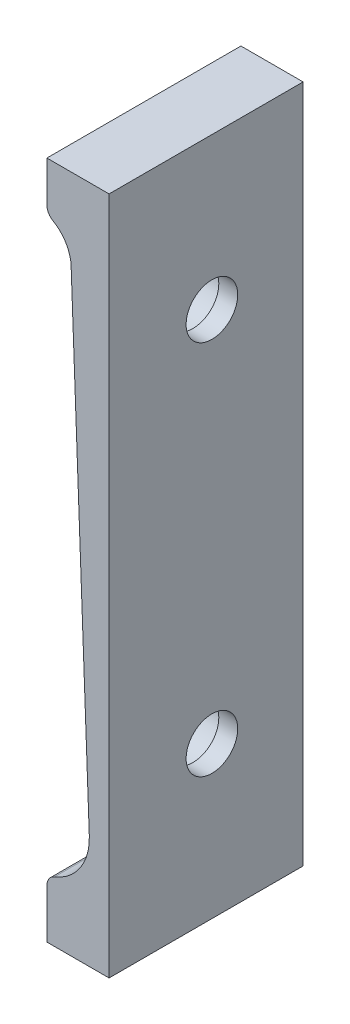
ISO-10303-21;
HEADER;
FILE_DESCRIPTION(('STEP AP214'),'2;1');
FILE_NAME('part.step','',(''),(''),'','','');
FILE_SCHEMA(('AUTOMOTIVE_DESIGN { 1 0 10303 214 1 1 1 1 }'));
ENDSEC;
DATA;
#1=APPLICATION_CONTEXT('core data for automotive mechanical design processes');
#2=APPLICATION_PROTOCOL_DEFINITION('international standard','automotive_design',2000,#1);
#3=PRODUCT_CONTEXT('',#1,'mechanical');
#4=PRODUCT('Part','Part','',(#3));
#5=PRODUCT_RELATED_PRODUCT_CATEGORY('part','',(#4));
#6=PRODUCT_DEFINITION_FORMATION('','',#4);
#7=PRODUCT_DEFINITION_CONTEXT('part definition',#1,'design');
#8=PRODUCT_DEFINITION('design','',#6,#7);
#9=PRODUCT_DEFINITION_SHAPE('','',#8);
#10=(LENGTH_UNIT() NAMED_UNIT(*) SI_UNIT(.MILLI.,.METRE.));
#11=(NAMED_UNIT(*) PLANE_ANGLE_UNIT() SI_UNIT($,.RADIAN.));
#12=(NAMED_UNIT(*) SI_UNIT($,.STERADIAN.) SOLID_ANGLE_UNIT());
#13=UNCERTAINTY_MEASURE_WITH_UNIT(LENGTH_MEASURE(1.E-05),#10,'distance_accuracy_value','');
#14=(GEOMETRIC_REPRESENTATION_CONTEXT(3) GLOBAL_UNCERTAINTY_ASSIGNED_CONTEXT((#13)) GLOBAL_UNIT_ASSIGNED_CONTEXT((#10,
#11,#12)) REPRESENTATION_CONTEXT('',''));
#15=CARTESIAN_POINT('',(0.,0.,0.));
#16=DIRECTION('',(0.,0.,1.));
#17=DIRECTION('',(1.,0.,0.));
#18=AXIS2_PLACEMENT_3D('',#15,#16,#17);
#19=CARTESIAN_POINT('',(110.652882407158,49.5871926880554,-20.574));
#20=DIRECTION('',(-1.,0.,0.));
#21=DIRECTION('',(0.,-1.,0.));
#22=AXIS2_PLACEMENT_3D('',#19,#20,#21);
#23=CYLINDRICAL_SURFACE('',#22,6.75767);
#24=CARTESIAN_POINT('',(110.652882407158,49.5871926880554,-20.574));
#25=DIRECTION('',(-1.,0.,0.));
#26=DIRECTION('',(0.,-1.,0.));
#27=AXIS2_PLACEMENT_3D('',#24,#25,#26);
#28=CIRCLE('',#27,6.75767);
#29=CARTESIAN_POINT('',(110.652882407158,42.8295226880554,-20.574));
#30=VERTEX_POINT('',#29);
#31=EDGE_CURVE('E156',#30,#30,#28,.T.);
#32=ORIENTED_EDGE('',*,*,#31,.F.);
#33=EDGE_LOOP('',(#32));
#34=FACE_BOUND('',#33,.T.);
#35=CARTESIAN_POINT('',(105.699882407158,49.5871926880554,-20.574));
#36=DIRECTION('',(-1.,0.,0.));
#37=DIRECTION('',(0.,-1.,0.));
#38=AXIS2_PLACEMENT_3D('',#35,#36,#37);
#39=CIRCLE('',#38,6.75767);
#40=CARTESIAN_POINT('',(105.699882407158,42.8295226880554,-20.574));
#41=VERTEX_POINT('',#40);
#42=EDGE_CURVE('E240',#41,#41,#39,.F.);
#43=ORIENTED_EDGE('',*,*,#42,.F.);
#44=EDGE_LOOP('',(#43));
#45=FACE_BOUND('',#44,.T.);
#46=ADVANCED_FACE('F44',(#34,#45),#23,.F.);
#47=CARTESIAN_POINT('',(110.652882407158,148.010668688055,-20.574));
#48=DIRECTION('',(-1.,0.,0.));
#49=DIRECTION('',(0.,-1.,0.));
#50=AXIS2_PLACEMENT_3D('',#47,#48,#49);
#51=CYLINDRICAL_SURFACE('',#50,6.75767);
#52=CARTESIAN_POINT('',(110.652882407158,148.010668688055,-20.574));
#53=DIRECTION('',(-1.,0.,0.));
#54=DIRECTION('',(0.,-1.,0.));
#55=AXIS2_PLACEMENT_3D('',#52,#53,#54);
#56=CIRCLE('',#55,6.75767);
#57=CARTESIAN_POINT('',(110.652882407158,141.252998688055,-20.574));
#58=VERTEX_POINT('',#57);
#59=EDGE_CURVE('E153',#58,#58,#56,.T.);
#60=ORIENTED_EDGE('',*,*,#59,.F.);
#61=EDGE_LOOP('',(#60));
#62=FACE_BOUND('',#61,.T.);
#63=CARTESIAN_POINT('',(105.699882407158,148.010668688055,-20.574));
#64=DIRECTION('',(-1.,0.,0.));
#65=DIRECTION('',(0.,-1.,0.));
#66=AXIS2_PLACEMENT_3D('',#63,#64,#65);
#67=CIRCLE('',#66,6.75767);
#68=CARTESIAN_POINT('',(105.699882407158,141.252998688055,-20.574));
#69=VERTEX_POINT('',#68);
#70=EDGE_CURVE('E243',#69,#69,#67,.F.);
#71=ORIENTED_EDGE('',*,*,#70,.F.);
#72=EDGE_LOOP('',(#71));
#73=FACE_BOUND('',#72,.T.);
#74=ADVANCED_FACE('F292',(#62,#73),#51,.F.);
#75=CARTESIAN_POINT('',(110.652882407158,187.698930688055,6.35));
#76=DIRECTION('',(-1.,0.,0.));
#77=DIRECTION('',(0.,-1.,0.));
#78=AXIS2_PLACEMENT_3D('',#75,#76,#77);
#79=PLANE('',#78);
#80=ORIENTED_EDGE('',*,*,#59,.T.);
#81=EDGE_LOOP('',(#80));
#82=FACE_BOUND('',#81,.T.);
#83=ORIENTED_EDGE('',*,*,#31,.T.);
#84=EDGE_LOOP('',(#83));
#85=FACE_BOUND('',#84,.T.);
#86=DIRECTION('',(0.,0.,-1.));
#87=VECTOR('',#86,1.);
#88=CARTESIAN_POINT('',(110.652882407158,9.89893068805531,6.35));
#89=LINE('',#88,#87);
#90=CARTESIAN_POINT('',(110.652882407158,9.89893068805531,6.35));
#91=VERTEX_POINT('',#90);
#92=CARTESIAN_POINT('',(110.652882407158,9.89893068805536,-44.45));
#93=VERTEX_POINT('',#92);
#94=EDGE_CURVE('E125',#91,#93,#89,.T.);
#95=ORIENTED_EDGE('',*,*,#94,.T.);
#96=DIRECTION('',(0.,-1.,0.));
#97=VECTOR('',#96,1.);
#98=CARTESIAN_POINT('',(110.652882407158,187.698930688055,-44.45));
#99=LINE('',#98,#97);
#100=CARTESIAN_POINT('',(110.652882407158,187.698930688055,-44.45));
#101=VERTEX_POINT('',#100);
#102=EDGE_CURVE('E130',#101,#93,#99,.T.);
#103=ORIENTED_EDGE('',*,*,#102,.F.);
#104=DIRECTION('',(0.,0.,-1.));
#105=VECTOR('',#104,1.);
#106=CARTESIAN_POINT('',(110.652882407158,187.698930688055,6.35));
#107=LINE('',#106,#105);
#108=CARTESIAN_POINT('',(110.652882407158,187.698930688055,6.35));
#109=VERTEX_POINT('',#108);
#110=EDGE_CURVE('E239',#109,#101,#107,.T.);
#111=ORIENTED_EDGE('',*,*,#110,.F.);
#112=DIRECTION('',(0.,1.,0.));
#113=VECTOR('',#112,1.);
#114=CARTESIAN_POINT('',(110.652882407158,187.698930688055,6.35));
#115=LINE('',#114,#113);
#116=EDGE_CURVE('E132',#91,#109,#115,.T.);
#117=ORIENTED_EDGE('',*,*,#116,.F.);
#118=EDGE_LOOP('',(#95,#103,#111,#117));
#119=FACE_BOUND('',#118,.T.);
#120=ADVANCED_FACE('F127',(#82,#85,#119),#79,.F.);
#121=CARTESIAN_POINT('',(110.652882407158,187.698930688055,6.35));
#122=DIRECTION('',(0.,-1.,0.));
#123=DIRECTION('',(1.,0.,0.));
#124=AXIS2_PLACEMENT_3D('',#121,#122,#123);
#125=PLANE('',#124);
#126=ORIENTED_EDGE('',*,*,#110,.T.);
#127=DIRECTION('',(1.,0.,0.));
#128=VECTOR('',#127,1.);
#129=CARTESIAN_POINT('',(110.652882407158,187.698930688055,-44.45));
#130=LINE('',#129,#128);
#131=CARTESIAN_POINT('',(94.3714824071577,187.698930688055,-44.45));
#132=VERTEX_POINT('',#131);
#133=EDGE_CURVE('E150',#132,#101,#130,.T.);
#134=ORIENTED_EDGE('',*,*,#133,.F.);
#135=DIRECTION('',(0.,0.,-1.));
#136=VECTOR('',#135,1.);
#137=CARTESIAN_POINT('',(94.3714824071576,187.698930688055,6.35));
#138=LINE('',#137,#136);
#139=CARTESIAN_POINT('',(94.3714824071576,187.698930688055,6.35));
#140=VERTEX_POINT('',#139);
#141=EDGE_CURVE('E248',#140,#132,#138,.T.);
#142=ORIENTED_EDGE('',*,*,#141,.F.);
#143=DIRECTION('',(-1.,0.,0.));
#144=VECTOR('',#143,1.);
#145=CARTESIAN_POINT('',(110.652882407158,187.698930688055,6.35));
#146=LINE('',#145,#144);
#147=EDGE_CURVE('E164',#109,#140,#146,.T.);
#148=ORIENTED_EDGE('',*,*,#147,.F.);
#149=EDGE_LOOP('',(#126,#134,#142,#148));
#150=FACE_BOUND('',#149,.T.);
#151=ADVANCED_FACE('F284',(#150),#125,.F.);
#152=CARTESIAN_POINT('',(91.1964824071576,166.018674566986,6.35));
#153=DIRECTION('',(0.,0.,-1.));
#154=DIRECTION('',(-1.,0.,0.));
#155=AXIS2_PLACEMENT_3D('',#152,#153,#154);
#156=CYLINDRICAL_SURFACE('',#155,9.52499999999998);
#157=CARTESIAN_POINT('',(91.1964824071576,166.018674566986,6.35));
#158=DIRECTION('',(0.,0.,-1.));
#159=DIRECTION('',(-1.,0.,0.));
#160=AXIS2_PLACEMENT_3D('',#157,#158,#159);
#161=CIRCLE('',#160,9.52499999999998);
#162=CARTESIAN_POINT('',(95.9589824071575,174.267566538033,6.35));
#163=VERTEX_POINT('',#162);
#164=CARTESIAN_POINT('',(100.714782785368,166.375862066986,6.35));
#165=VERTEX_POINT('',#164);
#166=EDGE_CURVE('E169',#163,#165,#161,.T.);
#167=ORIENTED_EDGE('',*,*,#166,.F.);
#168=DIRECTION('',(0.,0.,-1.));
#169=VECTOR('',#168,1.);
#170=CARTESIAN_POINT('',(95.9589824071575,174.267566538033,6.35));
#171=LINE('',#170,#169);
#172=CARTESIAN_POINT('',(95.9589824071575,174.267566538033,-6.35));
#173=VERTEX_POINT('',#172);
#174=EDGE_CURVE('E223',#163,#173,#171,.T.);
#175=ORIENTED_EDGE('',*,*,#174,.T.);
#176=CARTESIAN_POINT('',(91.1964824071576,166.018674566986,-6.35));
#177=DIRECTION('',(0.,0.,-1.));
#178=DIRECTION('',(-1.,0.,0.));
#179=AXIS2_PLACEMENT_3D('',#176,#177,#178);
#180=CIRCLE('',#179,9.52499999999998);
#181=CARTESIAN_POINT('',(100.714782785368,166.375862066986,-6.35));
#182=VERTEX_POINT('',#181);
#183=EDGE_CURVE('E161',#173,#182,#180,.T.);
#184=ORIENTED_EDGE('',*,*,#183,.T.);
#185=DIRECTION('',(0.,0.,-1.));
#186=VECTOR('',#185,1.);
#187=CARTESIAN_POINT('',(100.714782785368,166.375862066986,6.35));
#188=LINE('',#187,#186);
#189=EDGE_CURVE('E250',#165,#182,#188,.T.);
#190=ORIENTED_EDGE('',*,*,#189,.F.);
#191=EDGE_LOOP('',(#167,#175,#184,#190));
#192=FACE_BOUND('',#191,.T.);
#193=ADVANCED_FACE('F280',(#192),#156,.F.);
#194=CARTESIAN_POINT('',(102.511582983916,118.494891961922,6.35));
#195=DIRECTION('',(0.999296627633657,0.0375000000000004,0.));
#196=DIRECTION('',(-0.0375000000000004,0.999296627633657,0.));
#197=AXIS2_PLACEMENT_3D('',#194,#195,#196);
#198=PLANE('',#197);
#199=DIRECTION('',(0.0375000000000004,-0.999296627633657,0.));
#200=VECTOR('',#199,1.);
#201=CARTESIAN_POINT('',(102.511582983916,118.494891961922,-6.35));
#202=LINE('',#201,#200);
#203=CARTESIAN_POINT('',(105.473932974474,39.5544558169862,-6.35));
#204=VERTEX_POINT('',#203);
#205=EDGE_CURVE('E182',#182,#204,#202,.T.);
#206=ORIENTED_EDGE('',*,*,#205,.T.);
#207=DIRECTION('',(0.,0.,-1.));
#208=VECTOR('',#207,1.);
#209=CARTESIAN_POINT('',(105.473932974474,39.5544558169862,6.35));
#210=LINE('',#209,#208);
#211=CARTESIAN_POINT('',(105.473932974474,39.5544558169862,6.35));
#212=VERTEX_POINT('',#211);
#213=EDGE_CURVE('E253',#212,#204,#210,.T.);
#214=ORIENTED_EDGE('',*,*,#213,.F.);
#215=DIRECTION('',(0.0375000000000005,-0.999296627633657,0.));
#216=VECTOR('',#215,1.);
#217=CARTESIAN_POINT('',(100.714782785368,166.375862066986,6.35));
#218=LINE('',#217,#216);
#219=EDGE_CURVE('E171',#165,#212,#218,.T.);
#220=ORIENTED_EDGE('',*,*,#219,.F.);
#221=ORIENTED_EDGE('',*,*,#189,.T.);
#222=EDGE_LOOP('',(#206,#214,#220,#221));
#223=FACE_BOUND('',#222,.T.);
#224=ADVANCED_FACE('F263',(#223),#198,.F.);
#225=CARTESIAN_POINT('',(91.1964824071577,39.0186745669862,6.35));
#226=DIRECTION('',(0.,0.,-1.));
#227=DIRECTION('',(-1.,0.,0.));
#228=AXIS2_PLACEMENT_3D('',#225,#226,#227);
#229=CYLINDRICAL_SURFACE('',#228,14.2875);
#230=CARTESIAN_POINT('',(91.1964824071577,39.0186745669862,-6.35));
#231=DIRECTION('',(0.,0.,-1.));
#232=DIRECTION('',(1.,0.,0.));
#233=AXIS2_PLACEMENT_3D('',#230,#231,#232);
#234=CIRCLE('',#233,14.2875);
#235=CARTESIAN_POINT('',(96.3919369526122,25.7092828334727,-6.35));
#236=VERTEX_POINT('',#235);
#237=EDGE_CURVE('E165',#204,#236,#234,.T.);
#238=ORIENTED_EDGE('',*,*,#237,.T.);
#239=DIRECTION('',(0.,0.,-1.));
#240=VECTOR('',#239,1.);
#241=CARTESIAN_POINT('',(96.3919369526122,25.7092828334727,6.35));
#242=LINE('',#241,#240);
#243=CARTESIAN_POINT('',(96.3919369526122,25.7092828334727,6.35));
#244=VERTEX_POINT('',#243);
#245=EDGE_CURVE('E232',#236,#244,#242,.F.);
#246=ORIENTED_EDGE('',*,*,#245,.T.);
#247=CARTESIAN_POINT('',(91.1964824071577,39.0186745669862,6.35));
#248=DIRECTION('',(0.,0.,-1.));
#249=DIRECTION('',(1.,0.,0.));
#250=AXIS2_PLACEMENT_3D('',#247,#248,#249);
#251=CIRCLE('',#250,14.2875);
#252=EDGE_CURVE('E173',#212,#244,#251,.T.);
#253=ORIENTED_EDGE('',*,*,#252,.F.);
#254=ORIENTED_EDGE('',*,*,#213,.T.);
#255=EDGE_LOOP('',(#238,#246,#253,#254));
#256=FACE_BOUND('',#255,.T.);
#257=ADVANCED_FACE('F258',(#256),#229,.F.);
#258=CARTESIAN_POINT('',(94.3714824071576,9.89893068805536,6.35));
#259=DIRECTION('',(1.,0.,0.));
#260=DIRECTION('',(0.,1.,0.));
#261=AXIS2_PLACEMENT_3D('',#258,#259,#260);
#262=PLANE('',#261);
#263=CARTESIAN_POINT('',(94.3714824071575,148.010668688055,-20.574));
#264=DIRECTION('',(-1.,0.,0.));
#265=DIRECTION('',(0.,-1.,0.));
#266=AXIS2_PLACEMENT_3D('',#263,#264,#265);
#267=CIRCLE('',#266,8.7641176);
#268=CARTESIAN_POINT('',(94.3714824071575,139.246551088055,-20.574));
#269=VERTEX_POINT('',#268);
#270=EDGE_CURVE('E473',#269,#269,#267,.T.);
#271=ORIENTED_EDGE('',*,*,#270,.F.);
#272=EDGE_LOOP('',(#271));
#273=FACE_BOUND('',#272,.T.);
#274=CARTESIAN_POINT('',(94.3714824071576,49.5871926880554,-20.574));
#275=DIRECTION('',(-1.,0.,0.));
#276=DIRECTION('',(0.,-1.,0.));
#277=AXIS2_PLACEMENT_3D('',#274,#275,#276);
#278=CIRCLE('',#277,8.7641176);
#279=CARTESIAN_POINT('',(94.3714824071576,40.8230750880554,-20.574));
#280=VERTEX_POINT('',#279);
#281=EDGE_CURVE('E470',#280,#280,#278,.T.);
#282=ORIENTED_EDGE('',*,*,#281,.F.);
#283=EDGE_LOOP('',(#282));
#284=FACE_BOUND('',#283,.T.);
#285=DIRECTION('',(0.,-1.,0.));
#286=VECTOR('',#285,1.);
#287=CARTESIAN_POINT('',(94.3714824071576,9.89893068805536,6.35));
#288=LINE('',#287,#286);
#289=CARTESIAN_POINT('',(94.3714824071576,22.7516402260253,6.35));
#290=VERTEX_POINT('',#289);
#291=CARTESIAN_POINT('',(94.3714824071576,9.89893068805536,6.35));
#292=VERTEX_POINT('',#291);
#293=EDGE_CURVE('E176',#290,#292,#288,.T.);
#294=ORIENTED_EDGE('',*,*,#293,.F.);
#295=DIRECTION('',(0.,0.,-1.));
#296=VECTOR('',#295,1.);
#297=CARTESIAN_POINT('',(94.3714824071576,22.7516402260253,6.35));
#298=LINE('',#297,#296);
#299=CARTESIAN_POINT('',(94.3714824071576,22.7516402260253,-6.35));
#300=VERTEX_POINT('',#299);
#301=EDGE_CURVE('E234',#290,#300,#298,.T.);
#302=ORIENTED_EDGE('',*,*,#301,.T.);
#303=DIRECTION('',(0.,1.,0.));
#304=VECTOR('',#303,1.);
#305=CARTESIAN_POINT('',(94.3714824071577,187.698930688055,-6.35));
#306=LINE('',#305,#304);
#307=CARTESIAN_POINT('',(94.3714824071575,177.017197195049,-6.35));
#308=VERTEX_POINT('',#307);
#309=EDGE_CURVE('E151',#300,#308,#306,.T.);
#310=ORIENTED_EDGE('',*,*,#309,.T.);
#311=DIRECTION('',(0.,0.,-1.));
#312=VECTOR('',#311,1.);
#313=CARTESIAN_POINT('',(94.3714824071575,177.017197195049,6.35));
#314=LINE('',#313,#312);
#315=CARTESIAN_POINT('',(94.3714824071576,177.017197195049,6.35));
#316=VERTEX_POINT('',#315);
#317=EDGE_CURVE('E237',#308,#316,#314,.F.);
#318=ORIENTED_EDGE('',*,*,#317,.T.);
#319=DIRECTION('',(0.,-1.,0.));
#320=VECTOR('',#319,1.);
#321=CARTESIAN_POINT('',(94.3714824071576,187.698930688055,6.35));
#322=LINE('',#321,#320);
#323=EDGE_CURVE('E167',#140,#316,#322,.T.);
#324=ORIENTED_EDGE('',*,*,#323,.F.);
#325=ORIENTED_EDGE('',*,*,#141,.T.);
#326=DIRECTION('',(0.,1.,0.));
#327=VECTOR('',#326,1.);
#328=CARTESIAN_POINT('',(94.3714824071577,187.698930688055,-44.45));
#329=LINE('',#328,#327);
#330=CARTESIAN_POINT('',(94.3714824071576,9.89893068805536,-44.45));
#331=VERTEX_POINT('',#330);
#332=EDGE_CURVE('E145',#331,#132,#329,.T.);
#333=ORIENTED_EDGE('',*,*,#332,.F.);
#334=DIRECTION('',(0.,0.,-1.));
#335=VECTOR('',#334,1.);
#336=CARTESIAN_POINT('',(94.3714824071576,9.89893068805536,6.35));
#337=LINE('',#336,#335);
#338=EDGE_CURVE('E135',#292,#331,#337,.T.);
#339=ORIENTED_EDGE('',*,*,#338,.F.);
#340=EDGE_LOOP('',(#294,#302,#310,#318,#324,#325,#333,#339));
#341=FACE_BOUND('',#340,.T.);
#342=ADVANCED_FACE('F277',(#273,#284,#341),#262,.F.);
#343=CARTESIAN_POINT('',(94.3714824071576,9.89893068805536,6.35));
#344=DIRECTION('',(0.,1.,0.));
#345=DIRECTION('',(-1.,0.,0.));
#346=AXIS2_PLACEMENT_3D('',#343,#344,#345);
#347=PLANE('',#346);
#348=ORIENTED_EDGE('',*,*,#338,.T.);
#349=DIRECTION('',(-1.,0.,0.));
#350=VECTOR('',#349,1.);
#351=CARTESIAN_POINT('',(110.652882407158,9.89893068805536,-44.45));
#352=LINE('',#351,#350);
#353=EDGE_CURVE('E139',#93,#331,#352,.T.);
#354=ORIENTED_EDGE('',*,*,#353,.F.);
#355=ORIENTED_EDGE('',*,*,#94,.F.);
#356=DIRECTION('',(1.,0.,0.));
#357=VECTOR('',#356,1.);
#358=CARTESIAN_POINT('',(94.3714824071576,9.89893068805536,6.35));
#359=LINE('',#358,#357);
#360=EDGE_CURVE('E136',#292,#91,#359,.T.);
#361=ORIENTED_EDGE('',*,*,#360,.F.);
#362=EDGE_LOOP('',(#348,#354,#355,#361));
#363=FACE_BOUND('',#362,.T.);
#364=ADVANCED_FACE('F140',(#363),#347,.F.);
#365=CARTESIAN_POINT('',(91.1964824071577,39.0186745669862,6.35));
#366=DIRECTION('',(0.,0.,1.));
#367=DIRECTION('',(1.,0.,0.));
#368=AXIS2_PLACEMENT_3D('',#365,#366,#367);
#369=PLANE('',#368);
#370=ORIENTED_EDGE('',*,*,#252,.T.);
#371=CARTESIAN_POINT('',(97.5464824071576,22.7516402260253,6.35));
#372=DIRECTION('',(0.,0.,1.));
#373=DIRECTION('',(1.,0.,0.));
#374=AXIS2_PLACEMENT_3D('',#371,#372,#373);
#375=CIRCLE('',#374,3.175);
#376=EDGE_CURVE('E229',#244,#290,#375,.T.);
#377=ORIENTED_EDGE('',*,*,#376,.T.);
#378=ORIENTED_EDGE('',*,*,#293,.T.);
#379=ORIENTED_EDGE('',*,*,#360,.T.);
#380=ORIENTED_EDGE('',*,*,#116,.T.);
#381=ORIENTED_EDGE('',*,*,#147,.T.);
#382=ORIENTED_EDGE('',*,*,#323,.T.);
#383=CARTESIAN_POINT('',(97.5464824071575,177.017197195049,6.35));
#384=DIRECTION('',(0.,0.,1.));
#385=DIRECTION('',(1.,0.,0.));
#386=AXIS2_PLACEMENT_3D('',#383,#384,#385);
#387=CIRCLE('',#386,3.175);
#388=EDGE_CURVE('E67',#316,#163,#387,.T.);
#389=ORIENTED_EDGE('',*,*,#388,.T.);
#390=ORIENTED_EDGE('',*,*,#166,.T.);
#391=ORIENTED_EDGE('',*,*,#219,.T.);
#392=EDGE_LOOP('',(#370,#377,#378,#379,#380,#381,#382,#389,#390,#391));
#393=FACE_BOUND('',#392,.T.);
#394=ADVANCED_FACE('F278',(#393),#369,.T.);
#395=CARTESIAN_POINT('',(0.,0.,-6.35));
#396=DIRECTION('',(0.,0.,-1.));
#397=DIRECTION('',(-1.,0.,0.));
#398=AXIS2_PLACEMENT_3D('',#395,#396,#397);
#399=PLANE('',#398);
#400=ORIENTED_EDGE('',*,*,#237,.F.);
#401=ORIENTED_EDGE('',*,*,#205,.F.);
#402=ORIENTED_EDGE('',*,*,#183,.F.);
#403=CARTESIAN_POINT('',(97.5464824071575,177.017197195049,-6.35));
#404=DIRECTION('',(0.,0.,-1.));
#405=DIRECTION('',(-1.,0.,0.));
#406=AXIS2_PLACEMENT_3D('',#403,#404,#405);
#407=CIRCLE('',#406,3.175);
#408=EDGE_CURVE('E13',#173,#308,#407,.T.);
#409=ORIENTED_EDGE('',*,*,#408,.T.);
#410=ORIENTED_EDGE('',*,*,#309,.F.);
#411=CARTESIAN_POINT('',(97.5464824071576,22.7516402260253,-6.35));
#412=DIRECTION('',(0.,0.,-1.));
#413=DIRECTION('',(-1.,0.,0.));
#414=AXIS2_PLACEMENT_3D('',#411,#412,#413);
#415=CIRCLE('',#414,3.175);
#416=EDGE_CURVE('E54',#300,#236,#415,.T.);
#417=ORIENTED_EDGE('',*,*,#416,.T.);
#418=EDGE_LOOP('',(#400,#401,#402,#409,#410,#417));
#419=FACE_BOUND('',#418,.T.);
#420=ADVANCED_FACE('F269',(#419),#399,.F.);
#421=CARTESIAN_POINT('',(0.,0.,-44.45));
#422=DIRECTION('',(0.,0.,-1.));
#423=DIRECTION('',(-1.,0.,0.));
#424=AXIS2_PLACEMENT_3D('',#421,#422,#423);
#425=PLANE('',#424);
#426=ORIENTED_EDGE('',*,*,#102,.T.);
#427=ORIENTED_EDGE('',*,*,#353,.T.);
#428=ORIENTED_EDGE('',*,*,#332,.T.);
#429=ORIENTED_EDGE('',*,*,#133,.T.);
#430=EDGE_LOOP('',(#426,#427,#428,#429));
#431=FACE_BOUND('',#430,.T.);
#432=ADVANCED_FACE('F148',(#431),#425,.T.);
#433=CARTESIAN_POINT('',(105.699882407158,187.698930688055,6.35));
#434=DIRECTION('',(-1.,0.,0.));
#435=DIRECTION('',(0.,-1.,0.));
#436=AXIS2_PLACEMENT_3D('',#433,#434,#435);
#437=PLANE('',#436);
#438=CARTESIAN_POINT('',(105.699882407158,148.010668688055,-20.574));
#439=DIRECTION('',(-1.,0.,0.));
#440=DIRECTION('',(0.,-1.,0.));
#441=AXIS2_PLACEMENT_3D('',#438,#439,#440);
#442=CIRCLE('',#441,8.7641176);
#443=CARTESIAN_POINT('',(105.699882407158,139.246551088055,-20.574));
#444=VERTEX_POINT('',#443);
#445=EDGE_CURVE('E246',#444,#444,#442,.F.);
#446=ORIENTED_EDGE('',*,*,#445,.F.);
#447=EDGE_LOOP('',(#446));
#448=FACE_BOUND('',#447,.T.);
#449=ORIENTED_EDGE('',*,*,#70,.T.);
#450=EDGE_LOOP('',(#449));
#451=FACE_BOUND('',#450,.T.);
#452=ADVANCED_FACE('F309',(#448,#451),#437,.T.);
#453=CARTESIAN_POINT('',(135.441550351463,148.010668688055,-20.574));
#454=DIRECTION('',(-1.,0.,0.));
#455=DIRECTION('',(0.,-1.,0.));
#456=AXIS2_PLACEMENT_3D('',#453,#454,#455);
#457=CYLINDRICAL_SURFACE('',#456,8.7641176);
#458=ORIENTED_EDGE('',*,*,#445,.T.);
#459=EDGE_LOOP('',(#458));
#460=FACE_BOUND('',#459,.T.);
#461=ORIENTED_EDGE('',*,*,#270,.T.);
#462=EDGE_LOOP('',(#461));
#463=FACE_BOUND('',#462,.T.);
#464=ADVANCED_FACE('F359',(#460,#463),#457,.F.);
#465=CARTESIAN_POINT('',(105.699882407158,187.698930688055,6.35));
#466=DIRECTION('',(-1.,0.,0.));
#467=DIRECTION('',(0.,-1.,0.));
#468=AXIS2_PLACEMENT_3D('',#465,#466,#467);
#469=PLANE('',#468);
#470=CARTESIAN_POINT('',(105.699882407158,49.5871926880554,-20.574));
#471=DIRECTION('',(-1.,0.,0.));
#472=DIRECTION('',(0.,-1.,0.));
#473=AXIS2_PLACEMENT_3D('',#470,#471,#472);
#474=CIRCLE('',#473,8.7641176);
#475=CARTESIAN_POINT('',(105.699882407158,40.8230750880554,-20.574));
#476=VERTEX_POINT('',#475);
#477=EDGE_CURVE('E467',#476,#476,#474,.F.);
#478=ORIENTED_EDGE('',*,*,#477,.F.);
#479=EDGE_LOOP('',(#478));
#480=FACE_BOUND('',#479,.T.);
#481=ORIENTED_EDGE('',*,*,#42,.T.);
#482=EDGE_LOOP('',(#481));
#483=FACE_BOUND('',#482,.T.);
#484=ADVANCED_FACE('F368',(#480,#483),#469,.T.);
#485=CARTESIAN_POINT('',(135.441550351463,49.5871926880554,-20.574));
#486=DIRECTION('',(-1.,0.,0.));
#487=DIRECTION('',(0.,-1.,0.));
#488=AXIS2_PLACEMENT_3D('',#485,#486,#487);
#489=CYLINDRICAL_SURFACE('',#488,8.7641176);
#490=ORIENTED_EDGE('',*,*,#477,.T.);
#491=EDGE_LOOP('',(#490));
#492=FACE_BOUND('',#491,.T.);
#493=ORIENTED_EDGE('',*,*,#281,.T.);
#494=EDGE_LOOP('',(#493));
#495=FACE_BOUND('',#494,.T.);
#496=ADVANCED_FACE('F374',(#492,#495),#489,.F.);
#497=CARTESIAN_POINT('',(97.5464824071576,22.7516402260253,6.35));
#498=DIRECTION('',(0.,0.,-1.));
#499=DIRECTION('',(-1.,0.,0.));
#500=AXIS2_PLACEMENT_3D('',#497,#498,#499);
#501=CYLINDRICAL_SURFACE('',#500,3.175);
#502=ORIENTED_EDGE('',*,*,#376,.F.);
#503=ORIENTED_EDGE('',*,*,#245,.F.);
#504=ORIENTED_EDGE('',*,*,#416,.F.);
#505=ORIENTED_EDGE('',*,*,#301,.F.);
#506=EDGE_LOOP('',(#502,#503,#504,#505));
#507=FACE_BOUND('',#506,.T.);
#508=ADVANCED_FACE('F274',(#507),#501,.T.);
#509=CARTESIAN_POINT('',(97.5464824071575,177.017197195049,6.35));
#510=DIRECTION('',(0.,0.,-1.));
#511=DIRECTION('',(-1.,0.,0.));
#512=AXIS2_PLACEMENT_3D('',#509,#510,#511);
#513=CYLINDRICAL_SURFACE('',#512,3.175);
#514=ORIENTED_EDGE('',*,*,#388,.F.);
#515=ORIENTED_EDGE('',*,*,#317,.F.);
#516=ORIENTED_EDGE('',*,*,#408,.F.);
#517=ORIENTED_EDGE('',*,*,#174,.F.);
#518=EDGE_LOOP('',(#514,#515,#516,#517));
#519=FACE_BOUND('',#518,.T.);
#520=ADVANCED_FACE('F46',(#519),#513,.T.);
#521=CLOSED_SHELL('',(#46,#74,#120,#151,#193,#224,#257,#342,#364,#394,#420,#432,#452,#464,#484,
#496,#508,#520));
#522=MANIFOLD_SOLID_BREP('B2',#521);
#523=ADVANCED_BREP_SHAPE_REPRESENTATION('',(#18,#522),#14);
#524=SHAPE_DEFINITION_REPRESENTATION(#9,#523);
ENDSEC;
END-ISO-10303-21;
